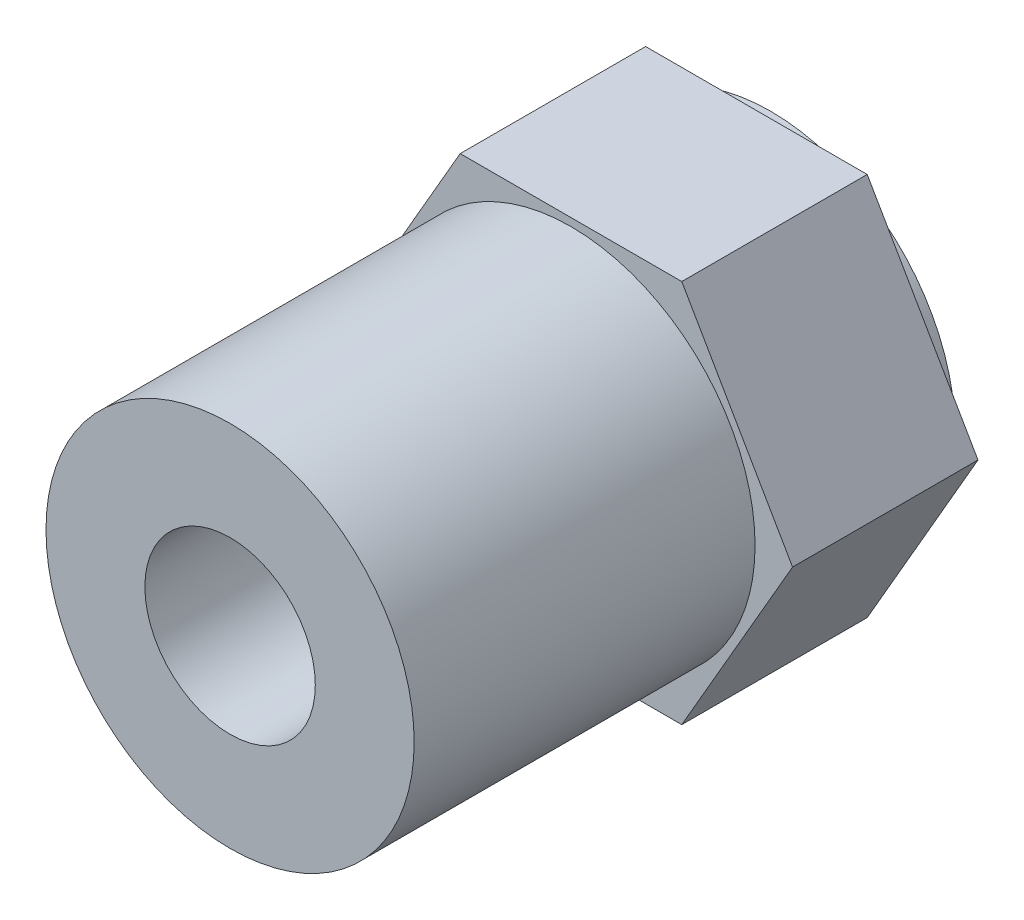
ISO-10303-21;
HEADER;
FILE_DESCRIPTION(('STEP AP214'),'2;1');
FILE_NAME('part.step','',(''),(''),'','','');
FILE_SCHEMA(('AUTOMOTIVE_DESIGN { 1 0 10303 214 1 1 1 1 }'));
ENDSEC;
DATA;
#1=APPLICATION_CONTEXT('core data for automotive mechanical design processes');
#2=APPLICATION_PROTOCOL_DEFINITION('international standard','automotive_design',2000,#1);
#3=PRODUCT_CONTEXT('',#1,'mechanical');
#4=PRODUCT('Part','Part','',(#3));
#5=PRODUCT_RELATED_PRODUCT_CATEGORY('part','',(#4));
#6=PRODUCT_DEFINITION_FORMATION('','',#4);
#7=PRODUCT_DEFINITION_CONTEXT('part definition',#1,'design');
#8=PRODUCT_DEFINITION('design','',#6,#7);
#9=PRODUCT_DEFINITION_SHAPE('','',#8);
#10=(LENGTH_UNIT() NAMED_UNIT(*) SI_UNIT(.MILLI.,.METRE.));
#11=(NAMED_UNIT(*) PLANE_ANGLE_UNIT() SI_UNIT($,.RADIAN.));
#12=(NAMED_UNIT(*) SI_UNIT($,.STERADIAN.) SOLID_ANGLE_UNIT());
#13=UNCERTAINTY_MEASURE_WITH_UNIT(LENGTH_MEASURE(1.E-05),#10,'distance_accuracy_value','');
#14=(GEOMETRIC_REPRESENTATION_CONTEXT(3) GLOBAL_UNCERTAINTY_ASSIGNED_CONTEXT((#13)) GLOBAL_UNIT_ASSIGNED_CONTEXT((#10,
#11,#12)) REPRESENTATION_CONTEXT('',''));
#15=CARTESIAN_POINT('',(0.,0.,0.));
#16=DIRECTION('',(0.,0.,1.));
#17=DIRECTION('',(1.,0.,0.));
#18=AXIS2_PLACEMENT_3D('',#15,#16,#17);
#19=CARTESIAN_POINT('',(4.1275,-7.14903970824055,20.1422));
#20=DIRECTION('',(-0.866025403784439,0.499999999999999,0.));
#21=DIRECTION('',(-0.499999999999999,-0.866025403784439,0.));
#22=AXIS2_PLACEMENT_3D('',#19,#20,#21);
#23=PLANE('',#22);
#24=DIRECTION('',(-0.499999999999999,-0.866025403784439,0.));
#25=VECTOR('',#24,1.);
#26=CARTESIAN_POINT('',(4.1275,-7.14903970824055,0.5334));
#27=LINE('',#26,#25);
#28=CARTESIAN_POINT('',(8.25499999999999,0.,0.5334));
#29=VERTEX_POINT('',#28);
#30=CARTESIAN_POINT('',(4.1275,-7.14903970824055,0.5334));
#31=VERTEX_POINT('',#30);
#32=EDGE_CURVE('E122',#29,#31,#27,.T.);
#33=ORIENTED_EDGE('',*,*,#32,.F.);
#34=DIRECTION('',(0.,0.,-1.));
#35=VECTOR('',#34,1.);
#36=CARTESIAN_POINT('',(8.25499999999999,0.,20.1422));
#37=LINE('',#36,#35);
#38=CARTESIAN_POINT('',(8.25499999999999,0.,7.4422));
#39=VERTEX_POINT('',#38);
#40=EDGE_CURVE('E189',#39,#29,#37,.T.);
#41=ORIENTED_EDGE('',*,*,#40,.F.);
#42=DIRECTION('',(0.499999999999999,0.866025403784439,0.));
#43=VECTOR('',#42,1.);
#44=CARTESIAN_POINT('',(4.1275,-7.14903970824055,7.4422));
#45=LINE('',#44,#43);
#46=CARTESIAN_POINT('',(4.1275,-7.14903970824055,7.4422));
#47=VERTEX_POINT('',#46);
#48=EDGE_CURVE('E180',#47,#39,#45,.T.);
#49=ORIENTED_EDGE('',*,*,#48,.F.);
#50=DIRECTION('',(0.,0.,-1.));
#51=VECTOR('',#50,1.);
#52=CARTESIAN_POINT('',(4.1275,-7.14903970824055,20.1422));
#53=LINE('',#52,#51);
#54=EDGE_CURVE('E176',#47,#31,#53,.T.);
#55=ORIENTED_EDGE('',*,*,#54,.T.);
#56=EDGE_LOOP('',(#33,#41,#49,#55));
#57=FACE_BOUND('',#56,.T.);
#58=ADVANCED_FACE('F107',(#57),#23,.F.);
#59=CARTESIAN_POINT('',(8.25499999999999,0.,20.1422));
#60=DIRECTION('',(-0.866025403784439,-0.5,0.));
#61=DIRECTION('',(0.5,-0.866025403784439,0.));
#62=AXIS2_PLACEMENT_3D('',#59,#60,#61);
#63=PLANE('',#62);
#64=DIRECTION('',(0.5,-0.866025403784439,0.));
#65=VECTOR('',#64,1.);
#66=CARTESIAN_POINT('',(8.25499999999999,0.,0.5334));
#67=LINE('',#66,#65);
#68=CARTESIAN_POINT('',(4.1275,7.14903970824054,0.5334));
#69=VERTEX_POINT('',#68);
#70=EDGE_CURVE('E235',#69,#29,#67,.T.);
#71=ORIENTED_EDGE('',*,*,#70,.F.);
#72=DIRECTION('',(0.,0.,-1.));
#73=VECTOR('',#72,1.);
#74=CARTESIAN_POINT('',(4.1275,7.14903970824054,20.1422));
#75=LINE('',#74,#73);
#76=CARTESIAN_POINT('',(4.1275,7.14903970824054,7.4422));
#77=VERTEX_POINT('',#76);
#78=EDGE_CURVE('E186',#77,#69,#75,.T.);
#79=ORIENTED_EDGE('',*,*,#78,.F.);
#80=DIRECTION('',(-0.5,0.866025403784439,0.));
#81=VECTOR('',#80,1.);
#82=CARTESIAN_POINT('',(8.25499999999999,0.,7.4422));
#83=LINE('',#82,#81);
#84=EDGE_CURVE('E245',#39,#77,#83,.T.);
#85=ORIENTED_EDGE('',*,*,#84,.F.);
#86=ORIENTED_EDGE('',*,*,#40,.T.);
#87=EDGE_LOOP('',(#71,#79,#85,#86));
#88=FACE_BOUND('',#87,.T.);
#89=ADVANCED_FACE('F225',(#88),#63,.F.);
#90=CARTESIAN_POINT('',(4.1275,7.14903970824054,20.1422));
#91=DIRECTION('',(0.,-1.,0.));
#92=DIRECTION('',(0.,0.,-1.));
#93=AXIS2_PLACEMENT_3D('',#90,#91,#92);
#94=PLANE('',#93);
#95=DIRECTION('',(1.,0.,0.));
#96=VECTOR('',#95,1.);
#97=CARTESIAN_POINT('',(4.1275,7.14903970824054,0.5334));
#98=LINE('',#97,#96);
#99=CARTESIAN_POINT('',(-4.12750000000001,7.14903970824054,0.5334));
#100=VERTEX_POINT('',#99);
#101=EDGE_CURVE('E238',#100,#69,#98,.T.);
#102=ORIENTED_EDGE('',*,*,#101,.F.);
#103=DIRECTION('',(0.,0.,-1.));
#104=VECTOR('',#103,1.);
#105=CARTESIAN_POINT('',(-4.12750000000001,7.14903970824054,20.1422));
#106=LINE('',#105,#104);
#107=CARTESIAN_POINT('',(-4.12750000000001,7.14903970824054,7.4422));
#108=VERTEX_POINT('',#107);
#109=EDGE_CURVE('E178',#108,#100,#106,.T.);
#110=ORIENTED_EDGE('',*,*,#109,.F.);
#111=DIRECTION('',(-1.,0.,0.));
#112=VECTOR('',#111,1.);
#113=CARTESIAN_POINT('',(4.1275,7.14903970824054,7.4422));
#114=LINE('',#113,#112);
#115=EDGE_CURVE('E243',#77,#108,#114,.T.);
#116=ORIENTED_EDGE('',*,*,#115,.F.);
#117=ORIENTED_EDGE('',*,*,#78,.T.);
#118=EDGE_LOOP('',(#102,#110,#116,#117));
#119=FACE_BOUND('',#118,.T.);
#120=ADVANCED_FACE('F222',(#119),#94,.F.);
#121=CARTESIAN_POINT('',(-4.12750000000001,7.14903970824054,20.1422));
#122=DIRECTION('',(0.866025403784439,-0.5,0.));
#123=DIRECTION('',(0.5,0.866025403784439,0.));
#124=AXIS2_PLACEMENT_3D('',#121,#122,#123);
#125=PLANE('',#124);
#126=DIRECTION('',(0.5,0.866025403784439,0.));
#127=VECTOR('',#126,1.);
#128=CARTESIAN_POINT('',(-4.12750000000001,7.14903970824054,0.5334));
#129=LINE('',#128,#127);
#130=CARTESIAN_POINT('',(-8.25500000000001,0.,0.5334));
#131=VERTEX_POINT('',#130);
#132=EDGE_CURVE('E172',#131,#100,#129,.T.);
#133=ORIENTED_EDGE('',*,*,#132,.F.);
#134=DIRECTION('',(0.,0.,-1.));
#135=VECTOR('',#134,1.);
#136=CARTESIAN_POINT('',(-8.25500000000001,0.,20.1422));
#137=LINE('',#136,#135);
#138=CARTESIAN_POINT('',(-8.25500000000001,0.,7.4422));
#139=VERTEX_POINT('',#138);
#140=EDGE_CURVE('E171',#139,#131,#137,.T.);
#141=ORIENTED_EDGE('',*,*,#140,.F.);
#142=DIRECTION('',(-0.5,-0.866025403784439,0.));
#143=VECTOR('',#142,1.);
#144=CARTESIAN_POINT('',(-4.12750000000001,7.14903970824054,7.4422));
#145=LINE('',#144,#143);
#146=EDGE_CURVE('E246',#108,#139,#145,.T.);
#147=ORIENTED_EDGE('',*,*,#146,.F.);
#148=ORIENTED_EDGE('',*,*,#109,.T.);
#149=EDGE_LOOP('',(#133,#141,#147,#148));
#150=FACE_BOUND('',#149,.T.);
#151=ADVANCED_FACE('F219',(#150),#125,.F.);
#152=CARTESIAN_POINT('',(-8.25500000000001,0.,20.1422));
#153=DIRECTION('',(0.866025403784439,0.5,0.));
#154=DIRECTION('',(-0.5,0.866025403784439,0.));
#155=AXIS2_PLACEMENT_3D('',#152,#153,#154);
#156=PLANE('',#155);
#157=DIRECTION('',(-0.5,0.866025403784439,0.));
#158=VECTOR('',#157,1.);
#159=CARTESIAN_POINT('',(-8.25500000000001,0.,0.5334));
#160=LINE('',#159,#158);
#161=CARTESIAN_POINT('',(-4.12750000000001,-7.14903970824055,0.5334));
#162=VERTEX_POINT('',#161);
#163=EDGE_CURVE('E159',#162,#131,#160,.T.);
#164=ORIENTED_EDGE('',*,*,#163,.F.);
#165=DIRECTION('',(0.,0.,-1.));
#166=VECTOR('',#165,1.);
#167=CARTESIAN_POINT('',(-4.12750000000001,-7.14903970824055,20.1422));
#168=LINE('',#167,#166);
#169=CARTESIAN_POINT('',(-4.12750000000001,-7.14903970824055,7.4422));
#170=VERTEX_POINT('',#169);
#171=EDGE_CURVE('E169',#170,#162,#168,.T.);
#172=ORIENTED_EDGE('',*,*,#171,.F.);
#173=DIRECTION('',(0.5,-0.866025403784439,0.));
#174=VECTOR('',#173,1.);
#175=CARTESIAN_POINT('',(-8.25500000000001,0.,7.4422));
#176=LINE('',#175,#174);
#177=EDGE_CURVE('E130',#139,#170,#176,.T.);
#178=ORIENTED_EDGE('',*,*,#177,.F.);
#179=ORIENTED_EDGE('',*,*,#140,.T.);
#180=EDGE_LOOP('',(#164,#172,#178,#179));
#181=FACE_BOUND('',#180,.T.);
#182=ADVANCED_FACE('F168',(#181),#156,.F.);
#183=CARTESIAN_POINT('',(-4.12750000000001,-7.14903970824055,20.1422));
#184=DIRECTION('',(0.,1.,0.));
#185=DIRECTION('',(0.,0.,1.));
#186=AXIS2_PLACEMENT_3D('',#183,#184,#185);
#187=PLANE('',#186);
#188=DIRECTION('',(-1.,0.,0.));
#189=VECTOR('',#188,1.);
#190=CARTESIAN_POINT('',(-4.12750000000001,-7.14903970824055,0.5334));
#191=LINE('',#190,#189);
#192=EDGE_CURVE('E13',#31,#162,#191,.T.);
#193=ORIENTED_EDGE('',*,*,#192,.F.);
#194=ORIENTED_EDGE('',*,*,#54,.F.);
#195=DIRECTION('',(1.,0.,0.));
#196=VECTOR('',#195,1.);
#197=CARTESIAN_POINT('',(-4.12750000000001,-7.14903970824055,7.4422));
#198=LINE('',#197,#196);
#199=EDGE_CURVE('E115',#170,#47,#198,.T.);
#200=ORIENTED_EDGE('',*,*,#199,.F.);
#201=ORIENTED_EDGE('',*,*,#171,.T.);
#202=EDGE_LOOP('',(#193,#194,#200,#201));
#203=FACE_BOUND('',#202,.T.);
#204=ADVANCED_FACE('F175',(#203),#187,.F.);
#205=CARTESIAN_POINT('',(0.,0.,7.4422));
#206=DIRECTION('',(0.,0.,1.));
#207=DIRECTION('',(1.,0.,0.));
#208=AXIS2_PLACEMENT_3D('',#205,#206,#207);
#209=PLANE('',#208);
#210=CARTESIAN_POINT('',(0.,0.,7.4422));
#211=DIRECTION('',(0.,0.,1.));
#212=DIRECTION('',(1.,0.,0.));
#213=AXIS2_PLACEMENT_3D('',#210,#211,#212);
#214=CIRCLE('',#213,6.858);
#215=CARTESIAN_POINT('',(6.858,0.,7.4422));
#216=VERTEX_POINT('',#215);
#217=EDGE_CURVE('E255',#216,#216,#214,.T.);
#218=ORIENTED_EDGE('',*,*,#217,.F.);
#219=EDGE_LOOP('',(#218));
#220=FACE_BOUND('',#219,.T.);
#221=ORIENTED_EDGE('',*,*,#48,.T.);
#222=ORIENTED_EDGE('',*,*,#84,.T.);
#223=ORIENTED_EDGE('',*,*,#115,.T.);
#224=ORIENTED_EDGE('',*,*,#146,.T.);
#225=ORIENTED_EDGE('',*,*,#177,.T.);
#226=ORIENTED_EDGE('',*,*,#199,.T.);
#227=EDGE_LOOP('',(#221,#222,#223,#224,#225,#226));
#228=FACE_BOUND('',#227,.T.);
#229=ADVANCED_FACE('F216',(#220,#228),#209,.T.);
#230=CARTESIAN_POINT('',(0.,0.,7.4422));
#231=DIRECTION('',(0.,0.,1.));
#232=DIRECTION('',(1.,0.,0.));
#233=AXIS2_PLACEMENT_3D('',#230,#231,#232);
#234=CYLINDRICAL_SURFACE('',#233,6.858);
#235=ORIENTED_EDGE('',*,*,#217,.T.);
#236=EDGE_LOOP('',(#235));
#237=FACE_BOUND('',#236,.T.);
#238=CARTESIAN_POINT('',(0.,0.,20.1422));
#239=DIRECTION('',(0.,0.,1.));
#240=DIRECTION('',(1.,0.,0.));
#241=AXIS2_PLACEMENT_3D('',#238,#239,#240);
#242=CIRCLE('',#241,6.858);
#243=CARTESIAN_POINT('',(6.858,0.,20.1422));
#244=VERTEX_POINT('',#243);
#245=EDGE_CURVE('E252',#244,#244,#242,.T.);
#246=ORIENTED_EDGE('',*,*,#245,.F.);
#247=EDGE_LOOP('',(#246));
#248=FACE_BOUND('',#247,.T.);
#249=ADVANCED_FACE('F262',(#237,#248),#234,.T.);
#250=CARTESIAN_POINT('',(0.,0.,20.1422));
#251=DIRECTION('',(0.,0.,1.));
#252=DIRECTION('',(1.,0.,0.));
#253=AXIS2_PLACEMENT_3D('',#250,#251,#252);
#254=PLANE('',#253);
#255=CARTESIAN_POINT('',(0.,0.,20.1422));
#256=DIRECTION('',(0.,0.,1.));
#257=DIRECTION('',(1.,0.,0.));
#258=AXIS2_PLACEMENT_3D('',#255,#256,#257);
#259=CIRCLE('',#258,3.175);
#260=CARTESIAN_POINT('',(3.175,0.,20.1422));
#261=VERTEX_POINT('',#260);
#262=EDGE_CURVE('E328',#261,#261,#259,.T.);
#263=ORIENTED_EDGE('',*,*,#262,.F.);
#264=EDGE_LOOP('',(#263));
#265=FACE_BOUND('',#264,.T.);
#266=ORIENTED_EDGE('',*,*,#245,.T.);
#267=EDGE_LOOP('',(#266));
#268=FACE_BOUND('',#267,.T.);
#269=ADVANCED_FACE('F212',(#265,#268),#254,.T.);
#270=CARTESIAN_POINT('',(0.,0.,0.5334));
#271=DIRECTION('',(0.,0.,-1.));
#272=DIRECTION('',(-1.,0.,0.));
#273=AXIS2_PLACEMENT_3D('',#270,#271,#272);
#274=PLANE('',#273);
#275=CARTESIAN_POINT('',(0.,0.,0.5334));
#276=DIRECTION('',(0.,0.,-1.));
#277=DIRECTION('',(-1.,0.,0.));
#278=AXIS2_PLACEMENT_3D('',#275,#276,#277);
#279=CIRCLE('',#278,6.858);
#280=CARTESIAN_POINT('',(-6.858,0.,0.5334));
#281=VERTEX_POINT('',#280);
#282=EDGE_CURVE('E173',#281,#281,#279,.T.);
#283=ORIENTED_EDGE('',*,*,#282,.F.);
#284=EDGE_LOOP('',(#283));
#285=FACE_BOUND('',#284,.T.);
#286=ORIENTED_EDGE('',*,*,#32,.T.);
#287=ORIENTED_EDGE('',*,*,#192,.T.);
#288=ORIENTED_EDGE('',*,*,#163,.T.);
#289=ORIENTED_EDGE('',*,*,#132,.T.);
#290=ORIENTED_EDGE('',*,*,#101,.T.);
#291=ORIENTED_EDGE('',*,*,#70,.T.);
#292=EDGE_LOOP('',(#286,#287,#288,#289,#290,#291));
#293=FACE_BOUND('',#292,.T.);
#294=ADVANCED_FACE('F158',(#285,#293),#274,.T.);
#295=CARTESIAN_POINT('',(0.,0.,0.5334));
#296=DIRECTION('',(0.,0.,-1.));
#297=DIRECTION('',(-1.,0.,0.));
#298=AXIS2_PLACEMENT_3D('',#295,#296,#297);
#299=CYLINDRICAL_SURFACE('',#298,6.858);
#300=ORIENTED_EDGE('',*,*,#282,.T.);
#301=EDGE_LOOP('',(#300));
#302=FACE_BOUND('',#301,.T.);
#303=CARTESIAN_POINT('',(0.,0.,0.));
#304=DIRECTION('',(0.,0.,-1.));
#305=DIRECTION('',(-1.,0.,0.));
#306=AXIS2_PLACEMENT_3D('',#303,#304,#305);
#307=CIRCLE('',#306,6.858);
#308=CARTESIAN_POINT('',(-6.858,0.,0.));
#309=VERTEX_POINT('',#308);
#310=EDGE_CURVE('E308',#309,#309,#307,.T.);
#311=ORIENTED_EDGE('',*,*,#310,.F.);
#312=EDGE_LOOP('',(#311));
#313=FACE_BOUND('',#312,.T.);
#314=ADVANCED_FACE('F211',(#302,#313),#299,.T.);
#315=CARTESIAN_POINT('',(0.,0.,0.));
#316=DIRECTION('',(0.,0.,1.));
#317=DIRECTION('',(1.,0.,0.));
#318=AXIS2_PLACEMENT_3D('',#315,#316,#317);
#319=PLANE('',#318);
#320=CARTESIAN_POINT('',(0.,0.,0.));
#321=DIRECTION('',(0.,0.,-1.));
#322=DIRECTION('',(-1.,0.,0.));
#323=AXIS2_PLACEMENT_3D('',#320,#321,#322);
#324=CIRCLE('',#323,2.18515372939925);
#325=CARTESIAN_POINT('',(-2.18515372939925,0.,0.));
#326=VERTEX_POINT('',#325);
#327=EDGE_CURVE('E196',#326,#326,#324,.T.);
#328=ORIENTED_EDGE('',*,*,#327,.F.);
#329=EDGE_LOOP('',(#328));
#330=FACE_BOUND('',#329,.T.);
#331=ORIENTED_EDGE('',*,*,#310,.T.);
#332=EDGE_LOOP('',(#331));
#333=FACE_BOUND('',#332,.T.);
#334=ADVANCED_FACE('F200',(#330,#333),#319,.F.);
#335=CARTESIAN_POINT('',(-2.18515372939925,2.10708837530826E-10,0.));
#336=CARTESIAN_POINT('',(-2.1383358195995,2.0619449073514E-10,0.174726818076848));
#337=CARTESIAN_POINT('',(-2.09151790979975,2.01680143939453E-10,0.349453636153695));
#338=CARTESIAN_POINT('',(-2.0447,1.97165797143767E-10,0.524180454230543));
#339=CARTESIAN_POINT('',(-2.18515372939925,-0.286035952019333,0.));
#340=CARTESIAN_POINT('',(-2.1383358195995,-0.279907502006432,0.174726818076848));
#341=CARTESIAN_POINT('',(-2.09151790979975,-0.273779051993531,0.349453636153695));
#342=CARTESIAN_POINT('',(-2.0447,-0.26765060198063,0.524180454230543));
#343=CARTESIAN_POINT('',(-2.07151853989751,-0.85799171371386,0.));
#344=CARTESIAN_POINT('',(-2.02713560131073,-0.83960559669266,0.174726818076848));
#345=CARTESIAN_POINT('',(-1.98275266272396,-0.82121947967146,0.349453636153696));
#346=CARTESIAN_POINT('',(-1.93836972413719,-0.802833362650261,0.524180454230543));
#347=CARTESIAN_POINT('',(-1.58535300137076,-1.58545792455025,0.));
#348=CARTESIAN_POINT('',(-1.55138813645869,-1.55149306508501,0.174726818076848));
#349=CARTESIAN_POINT('',(-1.51742327154662,-1.51752820561976,0.349453636153695));
#350=CARTESIAN_POINT('',(-1.48345840663455,-1.48356334615451,0.524180454230543));
#351=CARTESIAN_POINT('',(-0.858025547984629,-2.07144106390495,0.));
#352=CARTESIAN_POINT('',(-0.839639873573256,-2.02705810484833,0.174726818076848));
#353=CARTESIAN_POINT('',(-0.821254199161883,-1.98267514579171,0.349453636153695));
#354=CARTESIAN_POINT('',(-0.80286852475051,-1.93829218673508,0.524180454230543));
#355=CARTESIAN_POINT('',(0.,-2.24212525178794,0.));
#356=CARTESIAN_POINT('',(0.,-2.19408786744653,0.174726818076848));
#357=CARTESIAN_POINT('',(0.,-2.14605048310513,0.349453636153696));
#358=CARTESIAN_POINT('',(0.,-2.09801309876373,0.524180454230543));
#359=CARTESIAN_POINT('',(0.858025547984625,-2.07144106390494,0.));
#360=CARTESIAN_POINT('',(0.839639873573253,-2.02705810484833,0.174726818076848));
#361=CARTESIAN_POINT('',(0.821254199161881,-1.98267514579171,0.349453636153695));
#362=CARTESIAN_POINT('',(0.802868524750509,-1.93829218673509,0.524180454230542));
#363=CARTESIAN_POINT('',(1.58535300137076,-1.58545792455026,0.));
#364=CARTESIAN_POINT('',(1.55138813645869,-1.55149306508501,0.174726818076848));
#365=CARTESIAN_POINT('',(1.51742327154662,-1.51752820561976,0.349453636153696));
#366=CARTESIAN_POINT('',(1.48345840663455,-1.48356334615451,0.524180454230544));
#367=CARTESIAN_POINT('',(2.07151853989751,-0.857991713713857,0.));
#368=CARTESIAN_POINT('',(2.02713560131074,-0.839605596692659,0.174726818076848));
#369=CARTESIAN_POINT('',(1.98275266272397,-0.82121947967146,0.349453636153695));
#370=CARTESIAN_POINT('',(1.93836972413719,-0.802833362650262,0.524180454230543));
#371=CARTESIAN_POINT('',(2.18515372939925,-0.286035952019332,0.));
#372=CARTESIAN_POINT('',(2.1383358195995,-0.279907502006432,0.174726818076848));
#373=CARTESIAN_POINT('',(2.09151790979975,-0.273779051993531,0.349453636153695));
#374=CARTESIAN_POINT('',(2.0447,-0.26765060198063,0.524180454230543));
#375=CARTESIAN_POINT('',(2.18515372939925,0.286035952440751,0.));
#376=CARTESIAN_POINT('',(2.1383358195995,0.279907502418821,0.174726818076848));
#377=CARTESIAN_POINT('',(2.09151790979975,0.273779052396891,0.349453636153695));
#378=CARTESIAN_POINT('',(2.0447,0.267650602374961,0.524180454230543));
#379=CARTESIAN_POINT('',(2.07150623182405,0.858002991717212,0.));
#380=CARTESIAN_POINT('',(2.02712327120836,0.839619888444575,0.174726818076848));
#381=CARTESIAN_POINT('',(1.98274031059266,0.821236785171938,0.349453636153695));
#382=CARTESIAN_POINT('',(1.93835734997697,0.802853681899301,0.524180454230543));
#383=CARTESIAN_POINT('',(1.5854011065416,1.5854011065416,0.));
#384=CARTESIAN_POINT('',(1.55143316872384,1.55143316872383,0.174726818076848));
#385=CARTESIAN_POINT('',(1.51746523090607,1.51746523090607,0.349453636153695));
#386=CARTESIAN_POINT('',(1.48349729308831,1.4834972930883,0.524180454230543));
#387=CARTESIAN_POINT('',(0.858002991717209,2.07150623182405,0.));
#388=CARTESIAN_POINT('',(0.839619888444572,2.02712327120836,0.174726818076848));
#389=CARTESIAN_POINT('',(0.821236785171936,1.98274031059266,0.349453636153695));
#390=CARTESIAN_POINT('',(0.8028536818993,1.93835734997697,0.524180454230543));
#391=CARTESIAN_POINT('',(0.28603595244075,2.18515372939925,0.));
#392=CARTESIAN_POINT('',(0.27990750241882,2.1383358195995,0.174726818076848));
#393=CARTESIAN_POINT('',(0.273779052396891,2.09151790979975,0.349453636153695));
#394=CARTESIAN_POINT('',(0.267650602374962,2.0447,0.524180454230543));
#395=CARTESIAN_POINT('',(-0.286035952440751,2.18515372939925,0.));
#396=CARTESIAN_POINT('',(-0.279907502418821,2.1383358195995,0.174726818076848));
#397=CARTESIAN_POINT('',(-0.273779052396891,2.09151790979975,0.349453636153695));
#398=CARTESIAN_POINT('',(-0.26765060237496,2.0447,0.524180454230543));
#399=CARTESIAN_POINT('',(-0.858002991717211,2.07150623182404,0.));
#400=CARTESIAN_POINT('',(-0.839619888444575,2.02712327120835,0.174726818076848));
#401=CARTESIAN_POINT('',(-0.821236785171939,1.98274031059266,0.349453636153696));
#402=CARTESIAN_POINT('',(-0.802853681899303,1.93835734997697,0.524180454230544));
#403=CARTESIAN_POINT('',(-1.5854011065416,1.5854011065416,0.));
#404=CARTESIAN_POINT('',(-1.55143316872383,1.55143316872384,0.174726818076847));
#405=CARTESIAN_POINT('',(-1.51746523090607,1.51746523090607,0.349453636153694));
#406=CARTESIAN_POINT('',(-1.4834972930883,1.48349729308831,0.524180454230542));
#407=CARTESIAN_POINT('',(-2.07150623182405,0.858002991717207,0.));
#408=CARTESIAN_POINT('',(-2.02712327120836,0.839619888444572,0.174726818076848));
#409=CARTESIAN_POINT('',(-1.98274031059266,0.821236785171937,0.349453636153696));
#410=CARTESIAN_POINT('',(-1.93835734997697,0.802853681899302,0.524180454230543));
#411=CARTESIAN_POINT('',(-2.18515372939925,0.286035952440751,0.));
#412=CARTESIAN_POINT('',(-2.1383358195995,0.279907502418821,0.174726818076848));
#413=CARTESIAN_POINT('',(-2.09151790979975,0.273779052396891,0.349453636153695));
#414=CARTESIAN_POINT('',(-2.0447,0.267650602374961,0.524180454230543));
#415=CARTESIAN_POINT('',(-2.18515372939925,2.10708837530826E-10,0.));
#416=CARTESIAN_POINT('',(-2.1383358195995,2.0619449073514E-10,0.174726818076848));
#417=CARTESIAN_POINT('',(-2.09151790979975,2.01680143939453E-10,0.349453636153695));
#418=CARTESIAN_POINT('',(-2.0447,1.97165797143767E-10,0.524180454230543));
#419=B_SPLINE_SURFACE_WITH_KNOTS('',3,3,((#335,#336,#337,#338),(#339,#340,#341,#342),(#343,#344,
#345,#346),(#347,#348,#349,#350),(#351,#352,#353,#354),(#355,#356,#357,#358),(#359,#360,#361,
#362),(#363,#364,#365,#366),(#367,#368,#369,#370),(#371,#372,#373,#374),(#375,#376,#377,#378),
(#379,#380,#381,#382),(#383,#384,#385,#386),(#387,#388,#389,#390),(#391,#392,#393,#394),(#395,
#396,#397,#398),(#399,#400,#401,#402),(#403,#404,#405,#406),(#407,#408,#409,#410),(#411,#412,
#413,#414),(#415,#416,#417,#418)),.UNSPECIFIED.,.T.,.F.,.F.,(4,1,1,1,1,1,1,1,2,1,1,1,2,1,1,1,4),
(4,4),(0.,0.0625,0.125,0.1875,0.25,0.3125,0.375,0.4375,0.5,0.5625,0.625,0.6875,0.75,0.8125,
0.875,0.9375,1.),(0.,1.),.UNSPECIFIED.);
#420=CARTESIAN_POINT('',(-2.0447,1.97165797143767E-10,0.524180454230543));
#421=CARTESIAN_POINT('',(-2.0447,-0.26765060198063,0.524180454230543));
#422=CARTESIAN_POINT('',(-1.93836972413719,-0.802833362650261,0.524180454230543));
#423=CARTESIAN_POINT('',(-1.48345840663455,-1.48356334615451,0.524180454230543));
#424=CARTESIAN_POINT('',(-0.80286852475051,-1.93829218673508,0.524180454230543));
#425=CARTESIAN_POINT('',(0.,-2.09801309876373,0.524180454230543));
#426=CARTESIAN_POINT('',(0.802868524750509,-1.93829218673509,0.524180454230542));
#427=CARTESIAN_POINT('',(1.48345840663455,-1.48356334615451,0.524180454230544));
#428=CARTESIAN_POINT('',(1.93836972413719,-0.802833362650262,0.524180454230543));
#429=CARTESIAN_POINT('',(2.0447,-0.26765060198063,0.524180454230543));
#430=CARTESIAN_POINT('',(2.0447,0.267650602374961,0.524180454230543));
#431=CARTESIAN_POINT('',(1.93835734997697,0.802853681899301,0.524180454230543));
#432=CARTESIAN_POINT('',(1.48349729308831,1.4834972930883,0.524180454230543));
#433=CARTESIAN_POINT('',(0.8028536818993,1.93835734997697,0.524180454230543));
#434=CARTESIAN_POINT('',(0.267650602374962,2.0447,0.524180454230543));
#435=CARTESIAN_POINT('',(-0.26765060237496,2.0447,0.524180454230543));
#436=CARTESIAN_POINT('',(-0.802853681899303,1.93835734997697,0.524180454230544));
#437=CARTESIAN_POINT('',(-1.4834972930883,1.48349729308831,0.524180454230542));
#438=CARTESIAN_POINT('',(-1.93835734997697,0.802853681899302,0.524180454230543));
#439=CARTESIAN_POINT('',(-2.0447,0.267650602374961,0.524180454230543));
#440=CARTESIAN_POINT('',(-2.0447,1.97165797143767E-10,0.524180454230543));
#441=B_SPLINE_CURVE_WITH_KNOTS('',3,(#420,#421,#422,#423,#424,#425,#426,#427,#428,#429,#430,
#431,#432,#433,#434,#435,#436,#437,#438,#439,#440),.UNSPECIFIED.,.T.,.F.,(4,1,1,1,1,1,1,1,2,1,1,
1,2,1,1,1,4),(0.,0.0625,0.125,0.1875,0.25,0.3125,0.375,0.4375,0.5,0.5625,0.625,0.6875,0.75,
0.8125,0.875,0.9375,1.),.UNSPECIFIED.);
#442=CARTESIAN_POINT('',(-2.0447,1.97165797143767E-10,0.524180454230543));
#443=VERTEX_POINT('',#442);
#444=EDGE_CURVE('E309',#443,#443,#441,.F.);
#445=ORIENTED_EDGE('',*,*,#327,.T.);
#446=EDGE_LOOP('',(#445));
#447=FACE_BOUND('',#446,.T.);
#448=ORIENTED_EDGE('',*,*,#444,.F.);
#449=EDGE_LOOP('',(#448));
#450=FACE_BOUND('',#449,.T.);
#451=ADVANCED_FACE('F210',(#447,#450),#419,.F.);
#452=CARTESIAN_POINT('',(0.,0.,20.1422));
#453=DIRECTION('',(0.,0.,-1.));
#454=DIRECTION('',(0.,1.,0.));
#455=AXIS2_PLACEMENT_3D('',#452,#453,#454);
#456=CYLINDRICAL_SURFACE('',#455,2.0447);
#457=CARTESIAN_POINT('',(0.,0.,0.667047242313147));
#458=DIRECTION('',(0.,0.,1.));
#459=DIRECTION('',(1.,0.,0.));
#460=AXIS2_PLACEMENT_3D('',#457,#458,#459);
#461=CIRCLE('',#460,2.0447);
#462=CARTESIAN_POINT('',(2.0447,0.,0.667047242313147));
#463=VERTEX_POINT('',#462);
#464=EDGE_CURVE('E110',#463,#463,#461,.T.);
#465=ORIENTED_EDGE('',*,*,#464,.T.);
#466=EDGE_LOOP('',(#465));
#467=FACE_BOUND('',#466,.T.);
#468=ORIENTED_EDGE('',*,*,#444,.T.);
#469=EDGE_LOOP('',(#468));
#470=FACE_BOUND('',#469,.T.);
#471=ADVANCED_FACE('F282',(#467,#470),#456,.F.);
#472=CARTESIAN_POINT('',(0.,0.,1.3462));
#473=DIRECTION('',(0.,0.,1.));
#474=DIRECTION('',(1.,0.,0.));
#475=AXIS2_PLACEMENT_3D('',#472,#473,#474);
#476=CONICAL_SURFACE('',#475,3.17499999999999,1.02974425867665);
#477=CARTESIAN_POINT('',(0.,0.,1.3462));
#478=DIRECTION('',(0.,0.,1.));
#479=DIRECTION('',(1.,0.,0.));
#480=AXIS2_PLACEMENT_3D('',#477,#478,#479);
#481=CIRCLE('',#480,3.17499999999999);
#482=CARTESIAN_POINT('',(3.17499999999999,0.,1.3462));
#483=VERTEX_POINT('',#482);
#484=EDGE_CURVE('E324',#483,#483,#481,.T.);
#485=ORIENTED_EDGE('',*,*,#484,.T.);
#486=EDGE_LOOP('',(#485));
#487=FACE_BOUND('',#486,.T.);
#488=ORIENTED_EDGE('',*,*,#464,.F.);
#489=EDGE_LOOP('',(#488));
#490=FACE_BOUND('',#489,.T.);
#491=ADVANCED_FACE('F376',(#487,#490),#476,.F.);
#492=CARTESIAN_POINT('',(0.,0.,20.1422));
#493=DIRECTION('',(0.,0.,1.));
#494=DIRECTION('',(1.,0.,0.));
#495=AXIS2_PLACEMENT_3D('',#492,#493,#494);
#496=CYLINDRICAL_SURFACE('',#495,3.175);
#497=ORIENTED_EDGE('',*,*,#484,.F.);
#498=EDGE_LOOP('',(#497));
#499=FACE_BOUND('',#498,.T.);
#500=ORIENTED_EDGE('',*,*,#262,.T.);
#501=EDGE_LOOP('',(#500));
#502=FACE_BOUND('',#501,.T.);
#503=ADVANCED_FACE('F344',(#499,#502),#496,.F.);
#504=CLOSED_SHELL('',(#58,#89,#120,#151,#182,#204,#229,#249,#269,#294,#314,#334,#451,#471,#491,#503));
#505=MANIFOLD_SOLID_BREP('B2',#504);
#506=ADVANCED_BREP_SHAPE_REPRESENTATION('',(#18,#505),#14);
#507=SHAPE_DEFINITION_REPRESENTATION(#9,#506);
ENDSEC;
END-ISO-10303-21;
